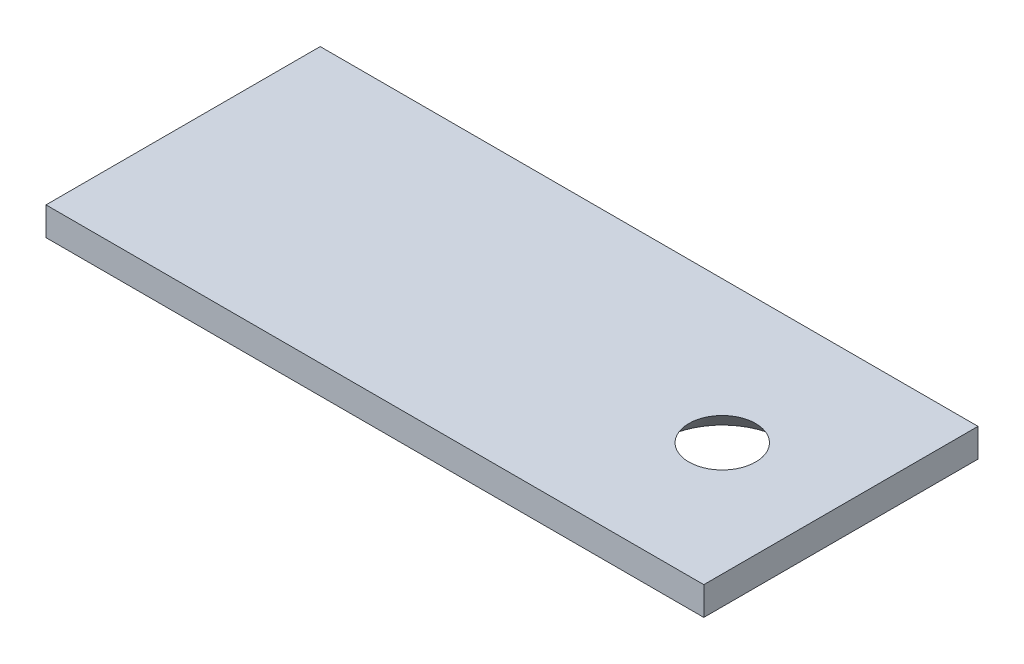
ISO-10303-21;
HEADER;
FILE_DESCRIPTION(('STEP AP214'),'2;1');
FILE_NAME('part.step','',(''),(''),'','','');
FILE_SCHEMA(('AUTOMOTIVE_DESIGN { 1 0 10303 214 1 1 1 1 }'));
ENDSEC;
DATA;
#1=APPLICATION_CONTEXT('core data for automotive mechanical design processes');
#2=APPLICATION_PROTOCOL_DEFINITION('international standard','automotive_design',2000,#1);
#3=PRODUCT_CONTEXT('',#1,'mechanical');
#4=PRODUCT('Part','Part','',(#3));
#5=PRODUCT_RELATED_PRODUCT_CATEGORY('part','',(#4));
#6=PRODUCT_DEFINITION_FORMATION('','',#4);
#7=PRODUCT_DEFINITION_CONTEXT('part definition',#1,'design');
#8=PRODUCT_DEFINITION('design','',#6,#7);
#9=PRODUCT_DEFINITION_SHAPE('','',#8);
#10=(LENGTH_UNIT() NAMED_UNIT(*) SI_UNIT(.MILLI.,.METRE.));
#11=(NAMED_UNIT(*) PLANE_ANGLE_UNIT() SI_UNIT($,.RADIAN.));
#12=(NAMED_UNIT(*) SI_UNIT($,.STERADIAN.) SOLID_ANGLE_UNIT());
#13=UNCERTAINTY_MEASURE_WITH_UNIT(LENGTH_MEASURE(1.E-05),#10,'distance_accuracy_value','');
#14=(GEOMETRIC_REPRESENTATION_CONTEXT(3) GLOBAL_UNCERTAINTY_ASSIGNED_CONTEXT((#13)) GLOBAL_UNIT_ASSIGNED_CONTEXT((#10,
#11,#12)) REPRESENTATION_CONTEXT('',''));
#15=CARTESIAN_POINT('',(0.,0.,0.));
#16=DIRECTION('',(0.,0.,1.));
#17=DIRECTION('',(1.,0.,0.));
#18=AXIS2_PLACEMENT_3D('',#15,#16,#17);
#19=CARTESIAN_POINT('',(-46.3,0.,0.));
#20=DIRECTION('',(0.,0.,1.));
#21=DIRECTION('',(1.,0.,0.));
#22=AXIS2_PLACEMENT_3D('',#19,#20,#21);
#23=PLANE('',#22);
#24=DIRECTION('',(0.,-1.,0.));
#25=VECTOR('',#24,1.);
#26=CARTESIAN_POINT('',(0.,0.,0.));
#27=LINE('',#26,#25);
#28=CARTESIAN_POINT('',(0.,2.,0.));
#29=VERTEX_POINT('',#28);
#30=CARTESIAN_POINT('',(0.,0.,0.));
#31=VERTEX_POINT('',#30);
#32=EDGE_CURVE('E106',#29,#31,#27,.T.);
#33=ORIENTED_EDGE('',*,*,#32,.F.);
#34=DIRECTION('',(1.,0.,0.));
#35=VECTOR('',#34,1.);
#36=CARTESIAN_POINT('',(-46.3,2.,0.));
#37=LINE('',#36,#35);
#38=CARTESIAN_POINT('',(-46.3,2.,0.));
#39=VERTEX_POINT('',#38);
#40=EDGE_CURVE('E55',#39,#29,#37,.T.);
#41=ORIENTED_EDGE('',*,*,#40,.F.);
#42=DIRECTION('',(0.,-1.,0.));
#43=VECTOR('',#42,1.);
#44=CARTESIAN_POINT('',(-46.3,0.,0.));
#45=LINE('',#44,#43);
#46=CARTESIAN_POINT('',(-46.3,0.,0.));
#47=VERTEX_POINT('',#46);
#48=EDGE_CURVE('E100',#39,#47,#45,.T.);
#49=ORIENTED_EDGE('',*,*,#48,.T.);
#50=DIRECTION('',(1.,0.,0.));
#51=VECTOR('',#50,1.);
#52=CARTESIAN_POINT('',(-46.3,0.,0.));
#53=LINE('',#52,#51);
#54=EDGE_CURVE('E83',#47,#31,#53,.T.);
#55=ORIENTED_EDGE('',*,*,#54,.T.);
#56=EDGE_LOOP('',(#33,#41,#49,#55));
#57=FACE_BOUND('',#56,.T.);
#58=ADVANCED_FACE('F38',(#57),#23,.T.);
#59=CARTESIAN_POINT('',(-46.3,2.,0.));
#60=DIRECTION('',(0.,1.,0.));
#61=DIRECTION('',(0.,0.,1.));
#62=AXIS2_PLACEMENT_3D('',#59,#60,#61);
#63=PLANE('',#62);
#64=CARTESIAN_POINT('',(-8.,2.,-9.3));
#65=DIRECTION('',(0.,1.,0.));
#66=DIRECTION('',(0.,0.,1.));
#67=AXIS2_PLACEMENT_3D('',#64,#65,#66);
#68=CIRCLE('',#67,2.35000000000001);
#69=CARTESIAN_POINT('',(-8.,2.,-6.94999999999999));
#70=VERTEX_POINT('',#69);
#71=EDGE_CURVE('E11',#70,#70,#68,.F.);
#72=ORIENTED_EDGE('',*,*,#71,.T.);
#73=EDGE_LOOP('',(#72));
#74=FACE_BOUND('',#73,.T.);
#75=DIRECTION('',(0.,0.,1.));
#76=VECTOR('',#75,1.);
#77=CARTESIAN_POINT('',(0.,2.,0.));
#78=LINE('',#77,#76);
#79=CARTESIAN_POINT('',(0.,2.,-19.3));
#80=VERTEX_POINT('',#79);
#81=EDGE_CURVE('E102',#80,#29,#78,.T.);
#82=ORIENTED_EDGE('',*,*,#81,.F.);
#83=DIRECTION('',(1.,0.,0.));
#84=VECTOR('',#83,1.);
#85=CARTESIAN_POINT('',(-46.3,2.,-19.3));
#86=LINE('',#85,#84);
#87=CARTESIAN_POINT('',(-46.3,2.,-19.3));
#88=VERTEX_POINT('',#87);
#89=EDGE_CURVE('E72',#88,#80,#86,.T.);
#90=ORIENTED_EDGE('',*,*,#89,.F.);
#91=DIRECTION('',(0.,0.,1.));
#92=VECTOR('',#91,1.);
#93=CARTESIAN_POINT('',(-46.3,2.,0.));
#94=LINE('',#93,#92);
#95=EDGE_CURVE('E97',#88,#39,#94,.T.);
#96=ORIENTED_EDGE('',*,*,#95,.T.);
#97=ORIENTED_EDGE('',*,*,#40,.T.);
#98=EDGE_LOOP('',(#82,#90,#96,#97));
#99=FACE_BOUND('',#98,.T.);
#100=ADVANCED_FACE('F130',(#74,#99),#63,.T.);
#101=CARTESIAN_POINT('',(-46.3,0.,-19.3));
#102=DIRECTION('',(0.,0.,-1.));
#103=DIRECTION('',(-1.,0.,0.));
#104=AXIS2_PLACEMENT_3D('',#101,#102,#103);
#105=PLANE('',#104);
#106=DIRECTION('',(0.,1.,0.));
#107=VECTOR('',#106,1.);
#108=CARTESIAN_POINT('',(0.,0.,-19.3));
#109=LINE('',#108,#107);
#110=CARTESIAN_POINT('',(0.,0.,-19.3));
#111=VERTEX_POINT('',#110);
#112=EDGE_CURVE('E91',#111,#80,#109,.T.);
#113=ORIENTED_EDGE('',*,*,#112,.F.);
#114=DIRECTION('',(1.,0.,0.));
#115=VECTOR('',#114,1.);
#116=CARTESIAN_POINT('',(-46.3,0.,-19.3));
#117=LINE('',#116,#115);
#118=CARTESIAN_POINT('',(-46.3,0.,-19.3));
#119=VERTEX_POINT('',#118);
#120=EDGE_CURVE('E86',#119,#111,#117,.T.);
#121=ORIENTED_EDGE('',*,*,#120,.F.);
#122=DIRECTION('',(0.,1.,0.));
#123=VECTOR('',#122,1.);
#124=CARTESIAN_POINT('',(-46.3,0.,-19.3));
#125=LINE('',#124,#123);
#126=EDGE_CURVE('E89',#119,#88,#125,.T.);
#127=ORIENTED_EDGE('',*,*,#126,.T.);
#128=ORIENTED_EDGE('',*,*,#89,.T.);
#129=EDGE_LOOP('',(#113,#121,#127,#128));
#130=FACE_BOUND('',#129,.T.);
#131=ADVANCED_FACE('F88',(#130),#105,.T.);
#132=CARTESIAN_POINT('',(-46.3,0.,0.));
#133=DIRECTION('',(0.,-1.,0.));
#134=DIRECTION('',(0.,0.,-1.));
#135=AXIS2_PLACEMENT_3D('',#132,#133,#134);
#136=PLANE('',#135);
#137=CARTESIAN_POINT('',(-8.,0.,-9.3));
#138=DIRECTION('',(0.,-1.,0.));
#139=DIRECTION('',(0.,0.,-1.));
#140=AXIS2_PLACEMENT_3D('',#137,#138,#139);
#141=CIRCLE('',#140,4.35000000000004);
#142=CARTESIAN_POINT('',(-8.,0.,-13.65));
#143=VERTEX_POINT('',#142);
#144=EDGE_CURVE('E47',#143,#143,#141,.F.);
#145=ORIENTED_EDGE('',*,*,#144,.T.);
#146=EDGE_LOOP('',(#145));
#147=FACE_BOUND('',#146,.T.);
#148=DIRECTION('',(0.,0.,-1.));
#149=VECTOR('',#148,1.);
#150=CARTESIAN_POINT('',(0.,0.,0.));
#151=LINE('',#150,#149);
#152=EDGE_CURVE('E109',#31,#111,#151,.T.);
#153=ORIENTED_EDGE('',*,*,#152,.F.);
#154=ORIENTED_EDGE('',*,*,#54,.F.);
#155=DIRECTION('',(0.,0.,-1.));
#156=VECTOR('',#155,1.);
#157=CARTESIAN_POINT('',(-46.3,0.,0.));
#158=LINE('',#157,#156);
#159=EDGE_CURVE('E96',#47,#119,#158,.T.);
#160=ORIENTED_EDGE('',*,*,#159,.T.);
#161=ORIENTED_EDGE('',*,*,#120,.T.);
#162=EDGE_LOOP('',(#153,#154,#160,#161));
#163=FACE_BOUND('',#162,.T.);
#164=ADVANCED_FACE('F99',(#147,#163),#136,.T.);
#165=CARTESIAN_POINT('',(-46.3,0.,0.));
#166=DIRECTION('',(-1.,0.,0.));
#167=DIRECTION('',(0.,0.,1.));
#168=AXIS2_PLACEMENT_3D('',#165,#166,#167);
#169=PLANE('',#168);
#170=ORIENTED_EDGE('',*,*,#48,.F.);
#171=ORIENTED_EDGE('',*,*,#95,.F.);
#172=ORIENTED_EDGE('',*,*,#126,.F.);
#173=ORIENTED_EDGE('',*,*,#159,.F.);
#174=EDGE_LOOP('',(#170,#171,#172,#173));
#175=FACE_BOUND('',#174,.T.);
#176=ADVANCED_FACE('F95',(#175),#169,.T.);
#177=CARTESIAN_POINT('',(0.,0.,0.));
#178=DIRECTION('',(-1.,0.,0.));
#179=DIRECTION('',(0.,0.,1.));
#180=AXIS2_PLACEMENT_3D('',#177,#178,#179);
#181=PLANE('',#180);
#182=ORIENTED_EDGE('',*,*,#32,.T.);
#183=ORIENTED_EDGE('',*,*,#152,.T.);
#184=ORIENTED_EDGE('',*,*,#112,.T.);
#185=ORIENTED_EDGE('',*,*,#81,.T.);
#186=EDGE_LOOP('',(#182,#183,#184,#185));
#187=FACE_BOUND('',#186,.T.);
#188=ADVANCED_FACE('F121',(#187),#181,.F.);
#189=CARTESIAN_POINT('',(-8.,0.,-9.3));
#190=DIRECTION('',(0.,-1.,0.));
#191=DIRECTION('',(0.,0.,-1.));
#192=AXIS2_PLACEMENT_3D('',#189,#190,#191);
#193=CONICAL_SURFACE('',#192,4.35000000000004,0.785398163397454);
#194=ORIENTED_EDGE('',*,*,#71,.F.);
#195=EDGE_LOOP('',(#194));
#196=FACE_BOUND('',#195,.T.);
#197=ORIENTED_EDGE('',*,*,#144,.F.);
#198=EDGE_LOOP('',(#197));
#199=FACE_BOUND('',#198,.T.);
#200=ADVANCED_FACE('F40',(#196,#199),#193,.F.);
#201=CLOSED_SHELL('',(#58,#100,#131,#164,#176,#188,#200));
#202=MANIFOLD_SOLID_BREP('B2',#201);
#203=ADVANCED_BREP_SHAPE_REPRESENTATION('',(#18,#202),#14);
#204=SHAPE_DEFINITION_REPRESENTATION(#9,#203);
ENDSEC;
END-ISO-10303-21;
